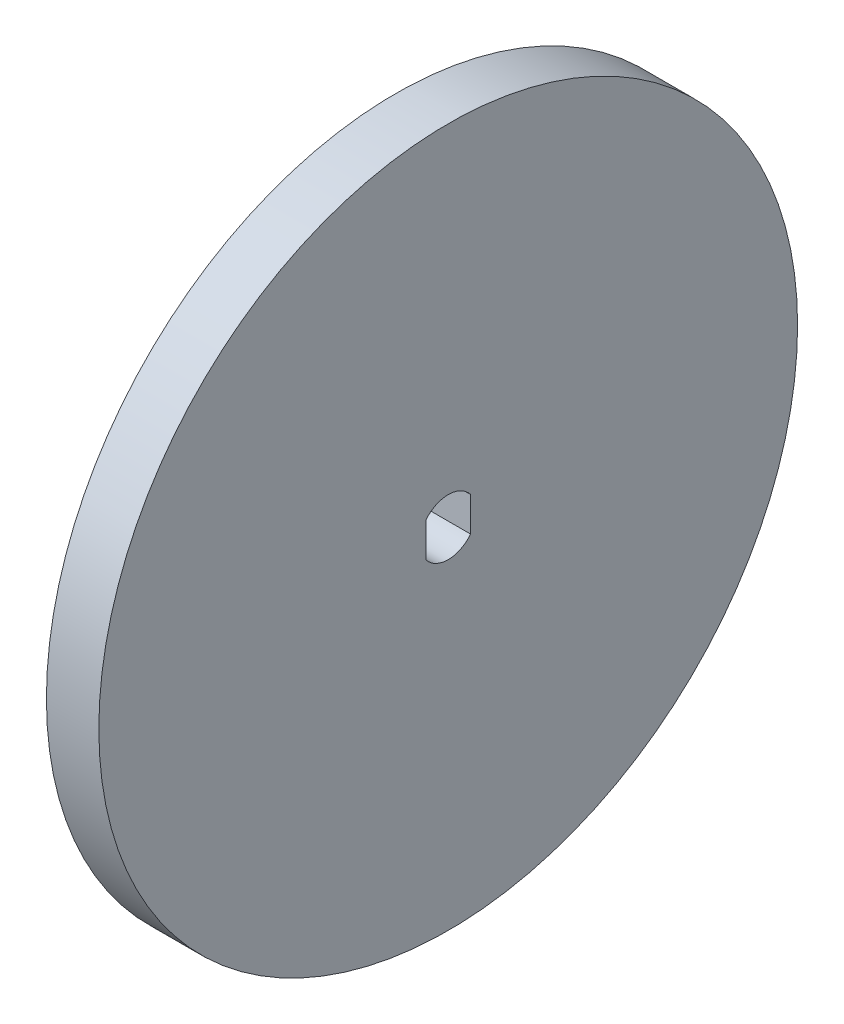
ISO-10303-21;
HEADER;
FILE_DESCRIPTION(('STEP AP214'),'2;1');
FILE_NAME('part.step','',(''),(''),'','','');
FILE_SCHEMA(('AUTOMOTIVE_DESIGN { 1 0 10303 214 1 1 1 1 }'));
ENDSEC;
DATA;
#1=APPLICATION_CONTEXT('core data for automotive mechanical design processes');
#2=APPLICATION_PROTOCOL_DEFINITION('international standard','automotive_design',2000,#1);
#3=PRODUCT_CONTEXT('',#1,'mechanical');
#4=PRODUCT('Part','Part','',(#3));
#5=PRODUCT_RELATED_PRODUCT_CATEGORY('part','',(#4));
#6=PRODUCT_DEFINITION_FORMATION('','',#4);
#7=PRODUCT_DEFINITION_CONTEXT('part definition',#1,'design');
#8=PRODUCT_DEFINITION('design','',#6,#7);
#9=PRODUCT_DEFINITION_SHAPE('','',#8);
#10=(LENGTH_UNIT() NAMED_UNIT(*) SI_UNIT(.MILLI.,.METRE.));
#11=(NAMED_UNIT(*) PLANE_ANGLE_UNIT() SI_UNIT($,.RADIAN.));
#12=(NAMED_UNIT(*) SI_UNIT($,.STERADIAN.) SOLID_ANGLE_UNIT());
#13=UNCERTAINTY_MEASURE_WITH_UNIT(LENGTH_MEASURE(1.E-05),#10,'distance_accuracy_value','');
#14=(GEOMETRIC_REPRESENTATION_CONTEXT(3) GLOBAL_UNCERTAINTY_ASSIGNED_CONTEXT((#13)) GLOBAL_UNIT_ASSIGNED_CONTEXT((#10,
#11,#12)) REPRESENTATION_CONTEXT('',''));
#15=CARTESIAN_POINT('',(0.,0.,0.));
#16=DIRECTION('',(0.,0.,1.));
#17=DIRECTION('',(1.,0.,0.));
#18=AXIS2_PLACEMENT_3D('',#15,#16,#17);
#19=CARTESIAN_POINT('',(2.7,0.,0.));
#20=DIRECTION('',(1.,0.,0.));
#21=DIRECTION('',(0.,0.,-1.));
#22=AXIS2_PLACEMENT_3D('',#19,#20,#21);
#23=PLANE('',#22);
#24=CARTESIAN_POINT('',(2.7,0.,0.));
#25=DIRECTION('',(1.,0.,0.));
#26=DIRECTION('',(0.,0.,-1.));
#27=AXIS2_PLACEMENT_3D('',#24,#25,#26);
#28=CIRCLE('',#27,18.);
#29=CARTESIAN_POINT('',(2.7,0.,18.));
#30=VERTEX_POINT('',#29);
#31=EDGE_CURVE('E11',#30,#30,#28,.T.);
#32=ORIENTED_EDGE('',*,*,#31,.T.);
#33=EDGE_LOOP('',(#32));
#34=FACE_BOUND('',#33,.T.);
#35=DIRECTION('',(0.,-1.,0.));
#36=VECTOR('',#35,1.);
#37=CARTESIAN_POINT('',(2.7,0.883176086632785,1.15));
#38=LINE('',#37,#36);
#39=CARTESIAN_POINT('',(2.7,0.883176086632785,1.15));
#40=VERTEX_POINT('',#39);
#41=CARTESIAN_POINT('',(2.7,-0.883176086632785,1.15));
#42=VERTEX_POINT('',#41);
#43=EDGE_CURVE('E82',#40,#42,#38,.T.);
#44=ORIENTED_EDGE('',*,*,#43,.F.);
#45=CARTESIAN_POINT('',(2.7,0.,0.));
#46=DIRECTION('',(1.,0.,0.));
#47=DIRECTION('',(0.,0.,-1.));
#48=AXIS2_PLACEMENT_3D('',#45,#46,#47);
#49=CIRCLE('',#48,1.45);
#50=CARTESIAN_POINT('',(2.7,0.883176086632785,-1.15));
#51=VERTEX_POINT('',#50);
#52=EDGE_CURVE('E74',#51,#40,#49,.T.);
#53=ORIENTED_EDGE('',*,*,#52,.F.);
#54=DIRECTION('',(0.,1.,0.));
#55=VECTOR('',#54,1.);
#56=CARTESIAN_POINT('',(2.7,0.883176086632785,-1.15));
#57=LINE('',#56,#55);
#58=CARTESIAN_POINT('',(2.7,-0.883176086632785,-1.15));
#59=VERTEX_POINT('',#58);
#60=EDGE_CURVE('E95',#59,#51,#57,.T.);
#61=ORIENTED_EDGE('',*,*,#60,.F.);
#62=CARTESIAN_POINT('',(2.7,0.,0.));
#63=DIRECTION('',(1.,0.,0.));
#64=DIRECTION('',(0.,0.,-1.));
#65=AXIS2_PLACEMENT_3D('',#62,#63,#64);
#66=CIRCLE('',#65,1.45);
#67=EDGE_CURVE('E93',#42,#59,#66,.T.);
#68=ORIENTED_EDGE('',*,*,#67,.F.);
#69=EDGE_LOOP('',(#44,#53,#61,#68));
#70=FACE_BOUND('',#69,.T.);
#71=ADVANCED_FACE('F33',(#34,#70),#23,.T.);
#72=CARTESIAN_POINT('',(0.,0.,0.));
#73=DIRECTION('',(1.,0.,0.));
#74=DIRECTION('',(0.,0.,-1.));
#75=AXIS2_PLACEMENT_3D('',#72,#73,#74);
#76=PLANE('',#75);
#77=CARTESIAN_POINT('',(0.,0.,0.));
#78=DIRECTION('',(1.,0.,0.));
#79=DIRECTION('',(0.,0.,-1.));
#80=AXIS2_PLACEMENT_3D('',#77,#78,#79);
#81=CIRCLE('',#80,18.);
#82=CARTESIAN_POINT('',(0.,0.,18.));
#83=VERTEX_POINT('',#82);
#84=EDGE_CURVE('E37',#83,#83,#81,.T.);
#85=ORIENTED_EDGE('',*,*,#84,.F.);
#86=EDGE_LOOP('',(#85));
#87=FACE_BOUND('',#86,.T.);
#88=CARTESIAN_POINT('',(0.,0.,0.));
#89=DIRECTION('',(1.,0.,0.));
#90=DIRECTION('',(0.,0.,-1.));
#91=AXIS2_PLACEMENT_3D('',#88,#89,#90);
#92=CIRCLE('',#91,1.45);
#93=CARTESIAN_POINT('',(0.,0.883176086632785,-1.15));
#94=VERTEX_POINT('',#93);
#95=CARTESIAN_POINT('',(0.,0.883176086632785,1.15));
#96=VERTEX_POINT('',#95);
#97=EDGE_CURVE('E56',#94,#96,#92,.T.);
#98=ORIENTED_EDGE('',*,*,#97,.T.);
#99=DIRECTION('',(0.,-1.,0.));
#100=VECTOR('',#99,1.);
#101=CARTESIAN_POINT('',(0.,0.883176086632785,1.15));
#102=LINE('',#101,#100);
#103=CARTESIAN_POINT('',(0.,-0.883176086632785,1.15));
#104=VERTEX_POINT('',#103);
#105=EDGE_CURVE('E89',#96,#104,#102,.T.);
#106=ORIENTED_EDGE('',*,*,#105,.T.);
#107=CARTESIAN_POINT('',(0.,0.,0.));
#108=DIRECTION('',(1.,0.,0.));
#109=DIRECTION('',(0.,0.,-1.));
#110=AXIS2_PLACEMENT_3D('',#107,#108,#109);
#111=CIRCLE('',#110,1.45);
#112=CARTESIAN_POINT('',(0.,-0.883176086632785,-1.15));
#113=VERTEX_POINT('',#112);
#114=EDGE_CURVE('E101',#104,#113,#111,.T.);
#115=ORIENTED_EDGE('',*,*,#114,.T.);
#116=DIRECTION('',(0.,1.,0.));
#117=VECTOR('',#116,1.);
#118=CARTESIAN_POINT('',(0.,0.883176086632785,-1.15));
#119=LINE('',#118,#117);
#120=EDGE_CURVE('E83',#113,#94,#119,.T.);
#121=ORIENTED_EDGE('',*,*,#120,.T.);
#122=EDGE_LOOP('',(#98,#106,#115,#121));
#123=FACE_BOUND('',#122,.T.);
#124=ADVANCED_FACE('F112',(#87,#123),#76,.F.);
#125=CARTESIAN_POINT('',(2.7,0.,0.));
#126=DIRECTION('',(-1.,0.,0.));
#127=DIRECTION('',(0.,0.,1.));
#128=AXIS2_PLACEMENT_3D('',#125,#126,#127);
#129=CYLINDRICAL_SURFACE('',#128,18.);
#130=CARTESIAN_POINT('',(2.7,0.,18.));
#131=CARTESIAN_POINT('',(2.671875,0.,18.));
#132=CARTESIAN_POINT('',(2.64375,0.,18.));
#133=CARTESIAN_POINT('',(2.5875,0.,18.));
#134=CARTESIAN_POINT('',(2.559375,0.,18.));
#135=CARTESIAN_POINT('',(2.503125,0.,18.));
#136=CARTESIAN_POINT('',(2.475,0.,18.));
#137=CARTESIAN_POINT('',(2.41875,0.,18.));
#138=CARTESIAN_POINT('',(2.390625,0.,18.));
#139=CARTESIAN_POINT('',(2.334375,0.,18.));
#140=CARTESIAN_POINT('',(2.30625,0.,18.));
#141=CARTESIAN_POINT('',(2.25,0.,18.));
#142=CARTESIAN_POINT('',(2.221875,0.,18.));
#143=CARTESIAN_POINT('',(2.165625,0.,18.));
#144=CARTESIAN_POINT('',(2.1375,0.,18.));
#145=CARTESIAN_POINT('',(2.08125,0.,18.));
#146=CARTESIAN_POINT('',(2.053125,0.,18.));
#147=CARTESIAN_POINT('',(1.996875,0.,18.));
#148=CARTESIAN_POINT('',(1.96875,0.,18.));
#149=CARTESIAN_POINT('',(1.9125,0.,18.));
#150=CARTESIAN_POINT('',(1.884375,0.,18.));
#151=CARTESIAN_POINT('',(1.828125,0.,18.));
#152=CARTESIAN_POINT('',(1.8,0.,18.));
#153=CARTESIAN_POINT('',(1.74375,0.,18.));
#154=CARTESIAN_POINT('',(1.715625,0.,18.));
#155=CARTESIAN_POINT('',(1.659375,0.,18.));
#156=CARTESIAN_POINT('',(1.63125,0.,18.));
#157=CARTESIAN_POINT('',(1.575,0.,18.));
#158=CARTESIAN_POINT('',(1.546875,0.,18.));
#159=CARTESIAN_POINT('',(1.490625,0.,18.));
#160=CARTESIAN_POINT('',(1.4625,0.,18.));
#161=CARTESIAN_POINT('',(1.40625,0.,18.));
#162=CARTESIAN_POINT('',(1.378125,0.,18.));
#163=CARTESIAN_POINT('',(1.321875,0.,18.));
#164=CARTESIAN_POINT('',(1.29375,0.,18.));
#165=CARTESIAN_POINT('',(1.2375,0.,18.));
#166=CARTESIAN_POINT('',(1.209375,0.,18.));
#167=CARTESIAN_POINT('',(1.153125,0.,18.));
#168=CARTESIAN_POINT('',(1.125,0.,18.));
#169=CARTESIAN_POINT('',(1.06875,0.,18.));
#170=CARTESIAN_POINT('',(1.040625,0.,18.));
#171=CARTESIAN_POINT('',(0.984375,0.,18.));
#172=CARTESIAN_POINT('',(0.95625,0.,18.));
#173=CARTESIAN_POINT('',(0.9,0.,18.));
#174=CARTESIAN_POINT('',(0.871875,0.,18.));
#175=CARTESIAN_POINT('',(0.815625,0.,18.));
#176=CARTESIAN_POINT('',(0.7875,0.,18.));
#177=CARTESIAN_POINT('',(0.73125,0.,18.));
#178=CARTESIAN_POINT('',(0.703125,0.,18.));
#179=CARTESIAN_POINT('',(0.646875,0.,18.));
#180=CARTESIAN_POINT('',(0.61875,0.,18.));
#181=CARTESIAN_POINT('',(0.5625,0.,18.));
#182=CARTESIAN_POINT('',(0.534375,0.,18.));
#183=CARTESIAN_POINT('',(0.478125,0.,18.));
#184=CARTESIAN_POINT('',(0.45,0.,18.));
#185=CARTESIAN_POINT('',(0.39375,0.,18.));
#186=CARTESIAN_POINT('',(0.365625,0.,18.));
#187=CARTESIAN_POINT('',(0.309375,0.,18.));
#188=CARTESIAN_POINT('',(0.28125,0.,18.));
#189=CARTESIAN_POINT('',(0.225,0.,18.));
#190=CARTESIAN_POINT('',(0.196875,0.,18.));
#191=CARTESIAN_POINT('',(0.140625,0.,18.));
#192=CARTESIAN_POINT('',(0.112499999999999,0.,18.));
#193=CARTESIAN_POINT('',(0.0562499999999994,0.,18.));
#194=CARTESIAN_POINT('',(0.0281249999999995,0.,18.));
#195=CARTESIAN_POINT('',(0.,0.,18.));
#196=B_SPLINE_CURVE_WITH_KNOTS('',3,(#130,#131,#132,#133,#134,#135,#136,#137,#138,#139,#140,
#141,#142,#143,#144,#145,#146,#147,#148,#149,#150,#151,#152,#153,#154,#155,#156,#157,#158,#159,
#160,#161,#162,#163,#164,#165,#166,#167,#168,#169,#170,#171,#172,#173,#174,#175,#176,#177,#178,
#179,#180,#181,#182,#183,#184,#185,#186,#187,#188,#189,#190,#191,#192,#193,#194,#195),
.UNSPECIFIED.,.F.,.F.,(4,2,2,2,2,2,2,2,2,2,2,2,2,2,2,2,2,2,2,2,2,2,2,2,2,2,2,2,2,2,2,2,4),(0.,
0.0843749999999998,0.16875,0.253125,0.3375,0.421875,0.50625,0.590625,0.675,0.759375,0.84375,
0.928125,1.0125,1.096875,1.18125,1.265625,1.35,1.434375,1.51875,1.603125,1.6875,1.771875,
1.85625,1.940625,2.025,2.109375,2.19375,2.278125,2.3625,2.446875,2.53125,2.615625,2.7),.UNSPECIFIED.);
#197=EDGE_CURVE('BSEAM35',#30,#83,#196,.T.);
#198=ORIENTED_EDGE('',*,*,#31,.F.);
#199=ORIENTED_EDGE('',*,*,#84,.T.);
#200=ORIENTED_EDGE('',*,*,#197,.T.);
#201=ORIENTED_EDGE('',*,*,#197,.F.);
#202=EDGE_LOOP('',(#198,#200,#199,#201));
#203=FACE_BOUND('',#202,.T.);
#204=ADVANCED_FACE('F35',(#203),#129,.T.);
#205=CARTESIAN_POINT('',(2.7,0.,0.));
#206=DIRECTION('',(-1.,0.,0.));
#207=DIRECTION('',(0.,0.,1.));
#208=AXIS2_PLACEMENT_3D('',#205,#206,#207);
#209=CYLINDRICAL_SURFACE('',#208,1.45);
#210=ORIENTED_EDGE('',*,*,#97,.F.);
#211=DIRECTION('',(-1.,0.,0.));
#212=VECTOR('',#211,1.);
#213=CARTESIAN_POINT('',(2.7,0.883176086632785,-1.15));
#214=LINE('',#213,#212);
#215=EDGE_CURVE('E78',#51,#94,#214,.T.);
#216=ORIENTED_EDGE('',*,*,#215,.F.);
#217=ORIENTED_EDGE('',*,*,#52,.T.);
#218=DIRECTION('',(-1.,0.,0.));
#219=VECTOR('',#218,1.);
#220=CARTESIAN_POINT('',(2.7,0.883176086632785,1.15));
#221=LINE('',#220,#219);
#222=EDGE_CURVE('E77',#40,#96,#221,.T.);
#223=ORIENTED_EDGE('',*,*,#222,.T.);
#224=EDGE_LOOP('',(#210,#216,#217,#223));
#225=FACE_BOUND('',#224,.T.);
#226=ADVANCED_FACE('F76',(#225),#209,.F.);
#227=CARTESIAN_POINT('',(2.7,0.883176086632785,1.15));
#228=DIRECTION('',(0.,0.,-1.));
#229=DIRECTION('',(-1.,0.,0.));
#230=AXIS2_PLACEMENT_3D('',#227,#228,#229);
#231=PLANE('',#230);
#232=ORIENTED_EDGE('',*,*,#105,.F.);
#233=ORIENTED_EDGE('',*,*,#222,.F.);
#234=ORIENTED_EDGE('',*,*,#43,.T.);
#235=DIRECTION('',(-1.,0.,0.));
#236=VECTOR('',#235,1.);
#237=CARTESIAN_POINT('',(2.7,-0.883176086632785,1.15));
#238=LINE('',#237,#236);
#239=EDGE_CURVE('E90',#42,#104,#238,.T.);
#240=ORIENTED_EDGE('',*,*,#239,.T.);
#241=EDGE_LOOP('',(#232,#233,#234,#240));
#242=FACE_BOUND('',#241,.T.);
#243=ADVANCED_FACE('F86',(#242),#231,.T.);
#244=CARTESIAN_POINT('',(2.7,0.,0.));
#245=DIRECTION('',(-1.,0.,0.));
#246=DIRECTION('',(0.,0.,1.));
#247=AXIS2_PLACEMENT_3D('',#244,#245,#246);
#248=CYLINDRICAL_SURFACE('',#247,1.45);
#249=ORIENTED_EDGE('',*,*,#114,.F.);
#250=ORIENTED_EDGE('',*,*,#239,.F.);
#251=ORIENTED_EDGE('',*,*,#67,.T.);
#252=DIRECTION('',(-1.,0.,0.));
#253=VECTOR('',#252,1.);
#254=CARTESIAN_POINT('',(2.7,-0.883176086632785,-1.15));
#255=LINE('',#254,#253);
#256=EDGE_CURVE('E48',#59,#113,#255,.T.);
#257=ORIENTED_EDGE('',*,*,#256,.T.);
#258=EDGE_LOOP('',(#249,#250,#251,#257));
#259=FACE_BOUND('',#258,.T.);
#260=ADVANCED_FACE('F110',(#259),#248,.F.);
#261=CARTESIAN_POINT('',(2.7,0.883176086632785,-1.15));
#262=DIRECTION('',(0.,0.,1.));
#263=DIRECTION('',(1.,0.,0.));
#264=AXIS2_PLACEMENT_3D('',#261,#262,#263);
#265=PLANE('',#264);
#266=ORIENTED_EDGE('',*,*,#120,.F.);
#267=ORIENTED_EDGE('',*,*,#256,.F.);
#268=ORIENTED_EDGE('',*,*,#60,.T.);
#269=ORIENTED_EDGE('',*,*,#215,.T.);
#270=EDGE_LOOP('',(#266,#267,#268,#269));
#271=FACE_BOUND('',#270,.T.);
#272=ADVANCED_FACE('F113',(#271),#265,.T.);
#273=CLOSED_SHELL('',(#71,#124,#204,#226,#243,#260,#272));
#274=MANIFOLD_SOLID_BREP('B2',#273);
#275=ADVANCED_BREP_SHAPE_REPRESENTATION('',(#18,#274),#14);
#276=SHAPE_DEFINITION_REPRESENTATION(#9,#275);
ENDSEC;
END-ISO-10303-21;
